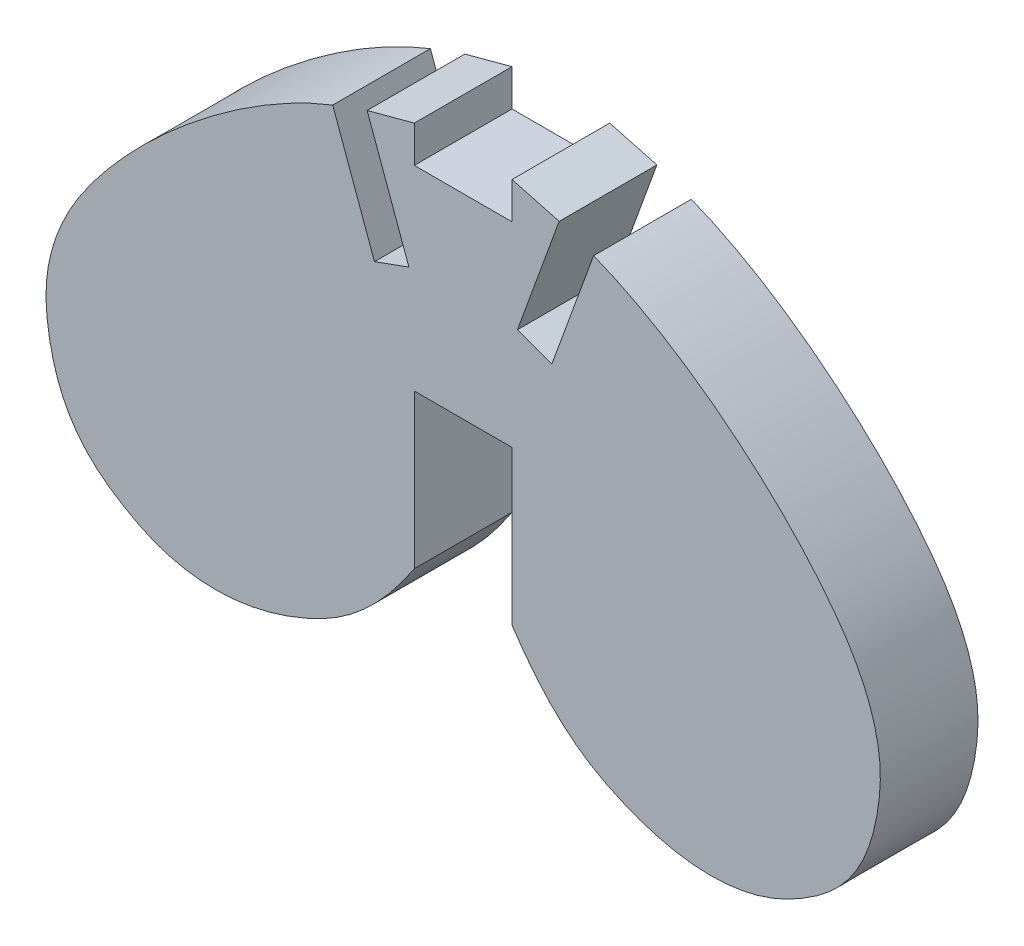
ISO-10303-21;
HEADER;
FILE_DESCRIPTION(('STEP AP214'),'2;1');
FILE_NAME('part.step','',(''),(''),'','','');
FILE_SCHEMA(('AUTOMOTIVE_DESIGN { 1 0 10303 214 1 1 1 1 }'));
ENDSEC;
DATA;
#1=APPLICATION_CONTEXT('core data for automotive mechanical design processes');
#2=APPLICATION_PROTOCOL_DEFINITION('international standard','automotive_design',2000,#1);
#3=PRODUCT_CONTEXT('',#1,'mechanical');
#4=PRODUCT('Part','Part','',(#3));
#5=PRODUCT_RELATED_PRODUCT_CATEGORY('part','',(#4));
#6=PRODUCT_DEFINITION_FORMATION('','',#4);
#7=PRODUCT_DEFINITION_CONTEXT('part definition',#1,'design');
#8=PRODUCT_DEFINITION('design','',#6,#7);
#9=PRODUCT_DEFINITION_SHAPE('','',#8);
#10=(LENGTH_UNIT() NAMED_UNIT(*) SI_UNIT(.MILLI.,.METRE.));
#11=(NAMED_UNIT(*) PLANE_ANGLE_UNIT() SI_UNIT($,.RADIAN.));
#12=(NAMED_UNIT(*) SI_UNIT($,.STERADIAN.) SOLID_ANGLE_UNIT());
#13=UNCERTAINTY_MEASURE_WITH_UNIT(LENGTH_MEASURE(1.E-05),#10,'distance_accuracy_value','');
#14=(GEOMETRIC_REPRESENTATION_CONTEXT(3) GLOBAL_UNCERTAINTY_ASSIGNED_CONTEXT((#13)) GLOBAL_UNIT_ASSIGNED_CONTEXT((#10,
#11,#12)) REPRESENTATION_CONTEXT('',''));
#15=CARTESIAN_POINT('',(0.,0.,0.));
#16=DIRECTION('',(0.,0.,1.));
#17=DIRECTION('',(1.,0.,0.));
#18=AXIS2_PLACEMENT_3D('',#15,#16,#17);
#19=CARTESIAN_POINT('',(5.34139058375699,8.46933169480644,4.));
#20=CARTESIAN_POINT('',(8.53715119367746,7.22233993817736,4.));
#21=CARTESIAN_POINT('',(12.8839976338933,3.92565225010513,4.));
#22=CARTESIAN_POINT('',(16.4867333985777,-0.954862824401219,4.));
#23=CARTESIAN_POINT('',(17.2144381127714,-3.29197694080423,4.));
#24=CARTESIAN_POINT('',(16.770315281095,-7.60801610574634,4.));
#25=CARTESIAN_POINT('',(15.2378407596264,-9.35147511525402,4.));
#26=CARTESIAN_POINT('',(11.4360685954806,-11.3722222813576,4.));
#27=CARTESIAN_POINT('',(8.75842967347823,-11.1537741046664,4.));
#28=CARTESIAN_POINT('',(5.63107059901179,-10.0079243395188,4.));
#29=CARTESIAN_POINT('',(3.70986781658025,-8.89821839332451,4.));
#30=CARTESIAN_POINT('',(1.99999999999991,-6.30219589203895,4.));
#31=B_SPLINE_CURVE_WITH_KNOTS('',3,(#19,#20,#21,#22,#23,#24,#25,#26,#27,#28,#29,#30),
.UNSPECIFIED.,.F.,.F.,(4,1,1,1,1,1,1,1,1,4),(0.,0.182310780318153,0.212904018318925,
0.295595895375633,0.328759179079127,0.511373571650366,0.559297998624515,0.760079021846469,
0.806658984774291,1.),.UNSPECIFIED.);
#32=DIRECTION('',(0.,0.,-1.));
#33=VECTOR('',#32,1.);
#34=SURFACE_OF_LINEAR_EXTRUSION('',#31,#33);
#35=CARTESIAN_POINT('',(5.34139058375699,8.46933169480644,0.));
#36=CARTESIAN_POINT('',(8.53715119367746,7.22233993817736,0.));
#37=CARTESIAN_POINT('',(12.8839976338933,3.92565225010513,0.));
#38=CARTESIAN_POINT('',(16.4867333985777,-0.954862824401219,0.));
#39=CARTESIAN_POINT('',(17.2144381127714,-3.29197694080423,0.));
#40=CARTESIAN_POINT('',(16.770315281095,-7.60801610574634,0.));
#41=CARTESIAN_POINT('',(15.2378407596264,-9.35147511525402,0.));
#42=CARTESIAN_POINT('',(11.4360685954806,-11.3722222813576,0.));
#43=CARTESIAN_POINT('',(8.75842967347823,-11.1537741046664,0.));
#44=CARTESIAN_POINT('',(5.63107059901179,-10.0079243395188,0.));
#45=CARTESIAN_POINT('',(3.70986781658025,-8.89821839332451,0.));
#46=CARTESIAN_POINT('',(1.99999999999991,-6.30219589203895,0.));
#47=B_SPLINE_CURVE_WITH_KNOTS('',3,(#35,#36,#37,#38,#39,#40,#41,#42,#43,#44,#45,#46),
.UNSPECIFIED.,.F.,.F.,(4,1,1,1,1,1,1,1,1,4),(0.,0.182310780318153,0.212904018318925,
0.295595895375633,0.328759179079127,0.511373571650366,0.559297998624515,0.760079021846469,
0.806658984774291,1.),.UNSPECIFIED.);
#48=CARTESIAN_POINT('',(5.34139058375699,8.46933169480644,0.));
#49=VERTEX_POINT('',#48);
#50=CARTESIAN_POINT('',(2.,-6.30219589203906,0.));
#51=VERTEX_POINT('',#50);
#52=EDGE_CURVE('E180',#49,#51,#47,.T.);
#53=ORIENTED_EDGE('',*,*,#52,.F.);
#54=DIRECTION('',(0.,0.,-1.));
#55=VECTOR('',#54,1.);
#56=CARTESIAN_POINT('',(5.34139058375699,8.46933169480644,4.));
#57=LINE('',#56,#55);
#58=CARTESIAN_POINT('',(5.34139058375699,8.46933169480644,4.));
#59=VERTEX_POINT('',#58);
#60=EDGE_CURVE('E11',#59,#49,#57,.T.);
#61=ORIENTED_EDGE('',*,*,#60,.F.);
#62=CARTESIAN_POINT('',(2.,-6.30219589203906,4.));
#63=VERTEX_POINT('',#62);
#64=EDGE_CURVE('E223',#59,#63,#31,.T.);
#65=ORIENTED_EDGE('',*,*,#64,.T.);
#66=DIRECTION('',(0.,0.,-1.));
#67=VECTOR('',#66,1.);
#68=CARTESIAN_POINT('',(2.,-6.30219589203906,4.));
#69=LINE('',#68,#67);
#70=EDGE_CURVE('E113',#63,#51,#69,.T.);
#71=ORIENTED_EDGE('',*,*,#70,.T.);
#72=EDGE_LOOP('',(#53,#61,#65,#71));
#73=FACE_BOUND('',#72,.T.);
#74=ADVANCED_FACE('F38',(#73),#34,.T.);
#75=CARTESIAN_POINT('',(1.99457584161243,-0.725966236333398,4.));
#76=DIRECTION('',(0.939692620785906,-0.342020143325675,0.));
#77=DIRECTION('',(0.342020143325675,0.939692620785906,0.));
#78=AXIS2_PLACEMENT_3D('',#75,#76,#77);
#79=PLANE('',#78);
#80=DIRECTION('',(-0.342020143325675,-0.939692620785906,0.));
#81=VECTOR('',#80,1.);
#82=CARTESIAN_POINT('',(1.99457584161243,-0.725966236333398,0.));
#83=LINE('',#82,#81);
#84=CARTESIAN_POINT('',(3.63128986712862,3.77086859087691,0.));
#85=VERTEX_POINT('',#84);
#86=EDGE_CURVE('E185',#49,#85,#83,.T.);
#87=ORIENTED_EDGE('',*,*,#86,.T.);
#88=DIRECTION('',(0.,0.,-1.));
#89=VECTOR('',#88,1.);
#90=CARTESIAN_POINT('',(3.63128986712862,3.77086859087691,4.));
#91=LINE('',#90,#89);
#92=CARTESIAN_POINT('',(3.63128986712862,3.77086859087691,4.));
#93=VERTEX_POINT('',#92);
#94=EDGE_CURVE('E47',#93,#85,#91,.T.);
#95=ORIENTED_EDGE('',*,*,#94,.F.);
#96=DIRECTION('',(-0.342020143325675,-0.939692620785906,0.));
#97=VECTOR('',#96,1.);
#98=CARTESIAN_POINT('',(1.99457584161243,-0.725966236333398,4.));
#99=LINE('',#98,#97);
#100=EDGE_CURVE('E350',#59,#93,#99,.T.);
#101=ORIENTED_EDGE('',*,*,#100,.F.);
#102=ORIENTED_EDGE('',*,*,#60,.T.);
#103=EDGE_LOOP('',(#87,#95,#101,#102));
#104=FACE_BOUND('',#103,.T.);
#105=ADVANCED_FACE('F345',(#104),#79,.F.);
#106=CARTESIAN_POINT('',(1.63671402551619,4.49683482721031,4.));
#107=DIRECTION('',(-0.342020143325676,-0.939692620785906,0.));
#108=DIRECTION('',(0.939692620785906,-0.342020143325676,0.));
#109=AXIS2_PLACEMENT_3D('',#106,#107,#108);
#110=PLANE('',#109);
#111=DIRECTION('',(-0.939692620785906,0.342020143325676,0.));
#112=VECTOR('',#111,1.);
#113=CARTESIAN_POINT('',(1.63671402551619,4.49683482721031,0.));
#114=LINE('',#113,#112);
#115=CARTESIAN_POINT('',(2.22175093594976,4.28389880586543,0.));
#116=VERTEX_POINT('',#115);
#117=EDGE_CURVE('E190',#85,#116,#114,.T.);
#118=ORIENTED_EDGE('',*,*,#117,.T.);
#119=DIRECTION('',(0.,0.,-1.));
#120=VECTOR('',#119,1.);
#121=CARTESIAN_POINT('',(2.22175093594976,4.28389880586543,4.));
#122=LINE('',#121,#120);
#123=CARTESIAN_POINT('',(2.22175093594976,4.28389880586543,4.));
#124=VERTEX_POINT('',#123);
#125=EDGE_CURVE('E254',#124,#116,#122,.T.);
#126=ORIENTED_EDGE('',*,*,#125,.F.);
#127=DIRECTION('',(-0.939692620785906,0.342020143325676,0.));
#128=VECTOR('',#127,1.);
#129=CARTESIAN_POINT('',(1.63671402551619,4.49683482721031,4.));
#130=LINE('',#129,#128);
#131=EDGE_CURVE('E263',#93,#124,#130,.T.);
#132=ORIENTED_EDGE('',*,*,#131,.F.);
#133=ORIENTED_EDGE('',*,*,#94,.T.);
#134=EDGE_LOOP('',(#118,#126,#132,#133));
#135=FACE_BOUND('',#134,.T.);
#136=ADVANCED_FACE('F261',(#135),#110,.F.);
#137=CARTESIAN_POINT('',(0.585036910433565,-0.212936021344885,4.));
#138=DIRECTION('',(-0.939692620785906,0.342020143325676,0.));
#139=DIRECTION('',(-0.342020143325676,-0.939692620785906,0.));
#140=AXIS2_PLACEMENT_3D('',#137,#138,#139);
#141=PLANE('',#140);
#142=DIRECTION('',(0.342020143325676,0.939692620785906,0.));
#143=VECTOR('',#142,1.);
#144=CARTESIAN_POINT('',(0.585036910433565,-0.212936021344885,0.));
#145=LINE('',#144,#143);
#146=CARTESIAN_POINT('',(3.93185165257814,8.98236190979495,0.));
#147=VERTEX_POINT('',#146);
#148=EDGE_CURVE('E192',#116,#147,#145,.T.);
#149=ORIENTED_EDGE('',*,*,#148,.T.);
#150=DIRECTION('',(0.,0.,-1.));
#151=VECTOR('',#150,1.);
#152=CARTESIAN_POINT('',(3.93185165257814,8.98236190979495,4.));
#153=LINE('',#152,#151);
#154=CARTESIAN_POINT('',(3.93185165257814,8.98236190979495,4.));
#155=VERTEX_POINT('',#154);
#156=EDGE_CURVE('E251',#155,#147,#153,.T.);
#157=ORIENTED_EDGE('',*,*,#156,.F.);
#158=DIRECTION('',(0.342020143325676,0.939692620785906,0.));
#159=VECTOR('',#158,1.);
#160=CARTESIAN_POINT('',(0.585036910433565,-0.212936021344885,4.));
#161=LINE('',#160,#159);
#162=EDGE_CURVE('E282',#124,#155,#161,.T.);
#163=ORIENTED_EDGE('',*,*,#162,.F.);
#164=ORIENTED_EDGE('',*,*,#125,.T.);
#165=EDGE_LOOP('',(#149,#157,#163,#164));
#166=FACE_BOUND('',#165,.T.);
#167=ADVANCED_FACE('F273',(#166),#141,.F.);
#168=CARTESIAN_POINT('',(2.5089745962156,9.36362066797607,4.));
#169=DIRECTION('',(-0.258819045102525,-0.965925826289067,0.));
#170=DIRECTION('',(0.965925826289067,-0.258819045102525,0.));
#171=AXIS2_PLACEMENT_3D('',#168,#169,#170);
#172=PLANE('',#171);
#173=DIRECTION('',(-0.965925826289067,0.258819045102525,0.));
#174=VECTOR('',#173,1.);
#175=CARTESIAN_POINT('',(2.5089745962156,9.36362066797607,0.));
#176=LINE('',#175,#174);
#177=CARTESIAN_POINT('',(2.,9.5,0.));
#178=VERTEX_POINT('',#177);
#179=EDGE_CURVE('E194',#147,#178,#176,.T.);
#180=ORIENTED_EDGE('',*,*,#179,.T.);
#181=DIRECTION('',(0.,0.,-1.));
#182=VECTOR('',#181,1.);
#183=CARTESIAN_POINT('',(2.,9.5,4.));
#184=LINE('',#183,#182);
#185=CARTESIAN_POINT('',(2.,9.5,4.));
#186=VERTEX_POINT('',#185);
#187=EDGE_CURVE('E248',#186,#178,#184,.T.);
#188=ORIENTED_EDGE('',*,*,#187,.F.);
#189=DIRECTION('',(-0.965925826289067,0.258819045102525,0.));
#190=VECTOR('',#189,1.);
#191=CARTESIAN_POINT('',(2.5089745962156,9.36362066797607,4.));
#192=LINE('',#191,#190);
#193=EDGE_CURVE('E279',#155,#186,#192,.T.);
#194=ORIENTED_EDGE('',*,*,#193,.F.);
#195=ORIENTED_EDGE('',*,*,#156,.T.);
#196=EDGE_LOOP('',(#180,#188,#194,#195));
#197=FACE_BOUND('',#196,.T.);
#198=ADVANCED_FACE('F277',(#197),#172,.F.);
#199=CARTESIAN_POINT('',(2.,0.,4.));
#200=DIRECTION('',(1.,0.,0.));
#201=DIRECTION('',(0.,0.,-1.));
#202=AXIS2_PLACEMENT_3D('',#199,#200,#201);
#203=PLANE('',#202);
#204=DIRECTION('',(0.,-1.,0.));
#205=VECTOR('',#204,1.);
#206=CARTESIAN_POINT('',(2.,0.,0.));
#207=LINE('',#206,#205);
#208=CARTESIAN_POINT('',(2.,8.,0.));
#209=VERTEX_POINT('',#208);
#210=EDGE_CURVE('E196',#178,#209,#207,.T.);
#211=ORIENTED_EDGE('',*,*,#210,.T.);
#212=DIRECTION('',(0.,0.,-1.));
#213=VECTOR('',#212,1.);
#214=CARTESIAN_POINT('',(2.,8.,4.));
#215=LINE('',#214,#213);
#216=CARTESIAN_POINT('',(2.,8.,4.));
#217=VERTEX_POINT('',#216);
#218=EDGE_CURVE('E245',#217,#209,#215,.T.);
#219=ORIENTED_EDGE('',*,*,#218,.F.);
#220=DIRECTION('',(0.,-1.,0.));
#221=VECTOR('',#220,1.);
#222=CARTESIAN_POINT('',(2.,0.,4.));
#223=LINE('',#222,#221);
#224=EDGE_CURVE('E281',#186,#217,#223,.T.);
#225=ORIENTED_EDGE('',*,*,#224,.F.);
#226=ORIENTED_EDGE('',*,*,#187,.T.);
#227=EDGE_LOOP('',(#211,#219,#225,#226));
#228=FACE_BOUND('',#227,.T.);
#229=ADVANCED_FACE('F335',(#228),#203,.F.);
#230=CARTESIAN_POINT('',(0.,8.,4.));
#231=DIRECTION('',(0.,-1.,0.));
#232=DIRECTION('',(0.,0.,-1.));
#233=AXIS2_PLACEMENT_3D('',#230,#231,#232);
#234=PLANE('',#233);
#235=DIRECTION('',(-1.,0.,0.));
#236=VECTOR('',#235,1.);
#237=CARTESIAN_POINT('',(0.,8.,0.));
#238=LINE('',#237,#236);
#239=CARTESIAN_POINT('',(-2.,8.,0.));
#240=VERTEX_POINT('',#239);
#241=EDGE_CURVE('E198',#209,#240,#238,.T.);
#242=ORIENTED_EDGE('',*,*,#241,.T.);
#243=DIRECTION('',(0.,0.,-1.));
#244=VECTOR('',#243,1.);
#245=CARTESIAN_POINT('',(-2.,8.,4.));
#246=LINE('',#245,#244);
#247=CARTESIAN_POINT('',(-2.,8.,4.));
#248=VERTEX_POINT('',#247);
#249=EDGE_CURVE('E242',#248,#240,#246,.T.);
#250=ORIENTED_EDGE('',*,*,#249,.F.);
#251=DIRECTION('',(-1.,0.,0.));
#252=VECTOR('',#251,1.);
#253=CARTESIAN_POINT('',(0.,8.,4.));
#254=LINE('',#253,#252);
#255=EDGE_CURVE('E284',#217,#248,#254,.T.);
#256=ORIENTED_EDGE('',*,*,#255,.F.);
#257=ORIENTED_EDGE('',*,*,#218,.T.);
#258=EDGE_LOOP('',(#242,#250,#256,#257));
#259=FACE_BOUND('',#258,.T.);
#260=ADVANCED_FACE('F331',(#259),#234,.F.);
#261=CARTESIAN_POINT('',(-2.,0.,4.));
#262=DIRECTION('',(-1.,0.,0.));
#263=DIRECTION('',(0.,0.,1.));
#264=AXIS2_PLACEMENT_3D('',#261,#262,#263);
#265=PLANE('',#264);
#266=DIRECTION('',(0.,1.,0.));
#267=VECTOR('',#266,1.);
#268=CARTESIAN_POINT('',(-2.,0.,0.));
#269=LINE('',#268,#267);
#270=CARTESIAN_POINT('',(-2.,9.5,0.));
#271=VERTEX_POINT('',#270);
#272=EDGE_CURVE('E200',#240,#271,#269,.T.);
#273=ORIENTED_EDGE('',*,*,#272,.T.);
#274=DIRECTION('',(0.,0.,-1.));
#275=VECTOR('',#274,1.);
#276=CARTESIAN_POINT('',(-2.,9.5,4.));
#277=LINE('',#276,#275);
#278=CARTESIAN_POINT('',(-2.,9.5,4.));
#279=VERTEX_POINT('',#278);
#280=EDGE_CURVE('E239',#279,#271,#277,.T.);
#281=ORIENTED_EDGE('',*,*,#280,.F.);
#282=DIRECTION('',(0.,1.,0.));
#283=VECTOR('',#282,1.);
#284=CARTESIAN_POINT('',(-2.,0.,4.));
#285=LINE('',#284,#283);
#286=EDGE_CURVE('E290',#248,#279,#285,.T.);
#287=ORIENTED_EDGE('',*,*,#286,.F.);
#288=ORIENTED_EDGE('',*,*,#249,.T.);
#289=EDGE_LOOP('',(#273,#281,#287,#288));
#290=FACE_BOUND('',#289,.T.);
#291=ADVANCED_FACE('F327',(#290),#265,.F.);
#292=CARTESIAN_POINT('',(-2.5089745962156,9.36362066797607,4.));
#293=DIRECTION('',(0.258819045102525,-0.965925826289067,0.));
#294=DIRECTION('',(0.965925826289067,0.258819045102525,0.));
#295=AXIS2_PLACEMENT_3D('',#292,#293,#294);
#296=PLANE('',#295);
#297=DIRECTION('',(-0.965925826289067,-0.258819045102525,0.));
#298=VECTOR('',#297,1.);
#299=CARTESIAN_POINT('',(-2.5089745962156,9.36362066797607,0.));
#300=LINE('',#299,#298);
#301=CARTESIAN_POINT('',(-3.93185165257813,8.98236190979495,0.));
#302=VERTEX_POINT('',#301);
#303=EDGE_CURVE('E202',#271,#302,#300,.T.);
#304=ORIENTED_EDGE('',*,*,#303,.T.);
#305=DIRECTION('',(0.,0.,-1.));
#306=VECTOR('',#305,1.);
#307=CARTESIAN_POINT('',(-3.93185165257813,8.98236190979495,4.));
#308=LINE('',#307,#306);
#309=CARTESIAN_POINT('',(-3.93185165257813,8.98236190979495,4.));
#310=VERTEX_POINT('',#309);
#311=EDGE_CURVE('E236',#310,#302,#308,.T.);
#312=ORIENTED_EDGE('',*,*,#311,.F.);
#313=DIRECTION('',(-0.965925826289067,-0.258819045102525,0.));
#314=VECTOR('',#313,1.);
#315=CARTESIAN_POINT('',(-2.5089745962156,9.36362066797607,4.));
#316=LINE('',#315,#314);
#317=EDGE_CURVE('E292',#279,#310,#316,.T.);
#318=ORIENTED_EDGE('',*,*,#317,.F.);
#319=ORIENTED_EDGE('',*,*,#280,.T.);
#320=EDGE_LOOP('',(#304,#312,#318,#319));
#321=FACE_BOUND('',#320,.T.);
#322=ADVANCED_FACE('F323',(#321),#296,.F.);
#323=CARTESIAN_POINT('',(-0.585036910433561,-0.212936021344884,4.));
#324=DIRECTION('',(0.939692620785906,0.342020143325676,0.));
#325=DIRECTION('',(-0.342020143325676,0.939692620785906,0.));
#326=AXIS2_PLACEMENT_3D('',#323,#324,#325);
#327=PLANE('',#326);
#328=DIRECTION('',(0.342020143325676,-0.939692620785906,0.));
#329=VECTOR('',#328,1.);
#330=CARTESIAN_POINT('',(-0.585036910433561,-0.212936021344884,0.));
#331=LINE('',#330,#329);
#332=CARTESIAN_POINT('',(-2.22175093594975,4.28389880586542,0.));
#333=VERTEX_POINT('',#332);
#334=EDGE_CURVE('E204',#302,#333,#331,.T.);
#335=ORIENTED_EDGE('',*,*,#334,.T.);
#336=DIRECTION('',(0.,0.,-1.));
#337=VECTOR('',#336,1.);
#338=CARTESIAN_POINT('',(-2.22175093594975,4.28389880586542,4.));
#339=LINE('',#338,#337);
#340=CARTESIAN_POINT('',(-2.22175093594975,4.28389880586542,4.));
#341=VERTEX_POINT('',#340);
#342=EDGE_CURVE('E233',#341,#333,#339,.T.);
#343=ORIENTED_EDGE('',*,*,#342,.F.);
#344=DIRECTION('',(0.342020143325676,-0.939692620785906,0.));
#345=VECTOR('',#344,1.);
#346=CARTESIAN_POINT('',(-0.585036910433561,-0.212936021344884,4.));
#347=LINE('',#346,#345);
#348=EDGE_CURVE('E294',#310,#341,#347,.T.);
#349=ORIENTED_EDGE('',*,*,#348,.F.);
#350=ORIENTED_EDGE('',*,*,#311,.T.);
#351=EDGE_LOOP('',(#335,#343,#349,#350));
#352=FACE_BOUND('',#351,.T.);
#353=ADVANCED_FACE('F319',(#352),#327,.F.);
#354=CARTESIAN_POINT('',(-1.63671402551619,4.4968348272103,4.));
#355=DIRECTION('',(0.342020143325676,-0.939692620785906,0.));
#356=DIRECTION('',(0.939692620785906,0.342020143325676,0.));
#357=AXIS2_PLACEMENT_3D('',#354,#355,#356);
#358=PLANE('',#357);
#359=DIRECTION('',(-0.939692620785906,-0.342020143325676,0.));
#360=VECTOR('',#359,1.);
#361=CARTESIAN_POINT('',(-1.63671402551619,4.4968348272103,0.));
#362=LINE('',#361,#360);
#363=CARTESIAN_POINT('',(-3.63128986712861,3.77086859087691,0.));
#364=VERTEX_POINT('',#363);
#365=EDGE_CURVE('E206',#333,#364,#362,.T.);
#366=ORIENTED_EDGE('',*,*,#365,.T.);
#367=DIRECTION('',(0.,0.,-1.));
#368=VECTOR('',#367,1.);
#369=CARTESIAN_POINT('',(-3.63128986712861,3.77086859087691,4.));
#370=LINE('',#369,#368);
#371=CARTESIAN_POINT('',(-3.63128986712861,3.77086859087691,4.));
#372=VERTEX_POINT('',#371);
#373=EDGE_CURVE('E230',#372,#364,#370,.T.);
#374=ORIENTED_EDGE('',*,*,#373,.F.);
#375=DIRECTION('',(-0.939692620785906,-0.342020143325676,0.));
#376=VECTOR('',#375,1.);
#377=CARTESIAN_POINT('',(-1.63671402551619,4.4968348272103,4.));
#378=LINE('',#377,#376);
#379=EDGE_CURVE('E296',#341,#372,#378,.T.);
#380=ORIENTED_EDGE('',*,*,#379,.F.);
#381=ORIENTED_EDGE('',*,*,#342,.T.);
#382=EDGE_LOOP('',(#366,#374,#380,#381));
#383=FACE_BOUND('',#382,.T.);
#384=ADVANCED_FACE('F315',(#383),#358,.F.);
#385=CARTESIAN_POINT('',(-1.99457584161242,-0.725966236333398,4.));
#386=DIRECTION('',(-0.939692620785906,-0.342020143325677,0.));
#387=DIRECTION('',(0.342020143325677,-0.939692620785906,0.));
#388=AXIS2_PLACEMENT_3D('',#385,#386,#387);
#389=PLANE('',#388);
#390=DIRECTION('',(-0.342020143325677,0.939692620785906,0.));
#391=VECTOR('',#390,1.);
#392=CARTESIAN_POINT('',(-1.99457584161242,-0.725966236333398,0.));
#393=LINE('',#392,#391);
#394=CARTESIAN_POINT('',(-5.34139058375699,8.46933169480643,0.));
#395=VERTEX_POINT('',#394);
#396=EDGE_CURVE('E208',#364,#395,#393,.T.);
#397=ORIENTED_EDGE('',*,*,#396,.T.);
#398=DIRECTION('',(0.,0.,-1.));
#399=VECTOR('',#398,1.);
#400=CARTESIAN_POINT('',(-5.34139058375699,8.46933169480643,4.));
#401=LINE('',#400,#399);
#402=CARTESIAN_POINT('',(-5.34139058375699,8.46933169480643,4.));
#403=VERTEX_POINT('',#402);
#404=EDGE_CURVE('E227',#403,#395,#401,.T.);
#405=ORIENTED_EDGE('',*,*,#404,.F.);
#406=DIRECTION('',(-0.342020143325677,0.939692620785906,0.));
#407=VECTOR('',#406,1.);
#408=CARTESIAN_POINT('',(-1.99457584161242,-0.725966236333398,4.));
#409=LINE('',#408,#407);
#410=EDGE_CURVE('E298',#372,#403,#409,.T.);
#411=ORIENTED_EDGE('',*,*,#410,.F.);
#412=ORIENTED_EDGE('',*,*,#373,.T.);
#413=EDGE_LOOP('',(#397,#405,#411,#412));
#414=FACE_BOUND('',#413,.T.);
#415=ADVANCED_FACE('F310',(#414),#389,.F.);
#416=CARTESIAN_POINT('',(-5.341390583757,8.46933169480643,4.));
#417=CARTESIAN_POINT('',(-8.53715119367747,7.22233993817735,4.));
#418=CARTESIAN_POINT('',(-12.8839976338933,3.92565225010513,4.));
#419=CARTESIAN_POINT('',(-16.4867333985777,-0.954862824401219,4.));
#420=CARTESIAN_POINT('',(-17.2144381127714,-3.29197694080422,4.));
#421=CARTESIAN_POINT('',(-16.770315281095,-7.60801610574634,4.));
#422=CARTESIAN_POINT('',(-15.2378407596264,-9.35147511525403,4.));
#423=CARTESIAN_POINT('',(-11.4360685954806,-11.3722222813576,4.));
#424=CARTESIAN_POINT('',(-8.75842967347823,-11.1537741046664,4.));
#425=CARTESIAN_POINT('',(-5.63107059901178,-10.0079243395188,4.));
#426=CARTESIAN_POINT('',(-3.70986781658022,-8.89821839332441,4.));
#427=CARTESIAN_POINT('',(-1.99999999999991,-6.30219589203895,4.));
#428=B_SPLINE_CURVE_WITH_KNOTS('',3,(#416,#417,#418,#419,#420,#421,#422,#423,#424,#425,#426,
#427),.UNSPECIFIED.,.F.,.F.,(4,1,1,1,1,1,1,1,1,4),(0.,0.182310780318153,0.212904018318925,
0.295595895375633,0.328759179079127,0.511373571650366,0.559297998624515,0.760079021846469,
0.806658984774291,1.),.UNSPECIFIED.);
#429=DIRECTION('',(0.,0.,-1.));
#430=VECTOR('',#429,1.);
#431=SURFACE_OF_LINEAR_EXTRUSION('',#428,#430);
#432=CARTESIAN_POINT('',(-5.341390583757,8.46933169480643,0.));
#433=CARTESIAN_POINT('',(-8.53715119367747,7.22233993817735,0.));
#434=CARTESIAN_POINT('',(-12.8839976338933,3.92565225010513,0.));
#435=CARTESIAN_POINT('',(-16.4867333985777,-0.954862824401219,0.));
#436=CARTESIAN_POINT('',(-17.2144381127714,-3.29197694080422,0.));
#437=CARTESIAN_POINT('',(-16.770315281095,-7.60801610574634,0.));
#438=CARTESIAN_POINT('',(-15.2378407596264,-9.35147511525403,0.));
#439=CARTESIAN_POINT('',(-11.4360685954806,-11.3722222813576,0.));
#440=CARTESIAN_POINT('',(-8.75842967347823,-11.1537741046664,0.));
#441=CARTESIAN_POINT('',(-5.63107059901178,-10.0079243395188,0.));
#442=CARTESIAN_POINT('',(-3.70986781658022,-8.89821839332441,0.));
#443=CARTESIAN_POINT('',(-1.99999999999991,-6.30219589203895,0.));
#444=B_SPLINE_CURVE_WITH_KNOTS('',3,(#432,#433,#434,#435,#436,#437,#438,#439,#440,#441,#442,
#443),.UNSPECIFIED.,.F.,.F.,(4,1,1,1,1,1,1,1,1,4),(0.,0.182310780318153,0.212904018318925,
0.295595895375633,0.328759179079127,0.511373571650366,0.559297998624515,0.760079021846469,
0.806658984774291,1.),.UNSPECIFIED.);
#445=CARTESIAN_POINT('',(-2.,-6.30219589203895,0.));
#446=VERTEX_POINT('',#445);
#447=EDGE_CURVE('E210',#395,#446,#444,.T.);
#448=ORIENTED_EDGE('',*,*,#447,.T.);
#449=DIRECTION('',(0.,0.,-1.));
#450=VECTOR('',#449,1.);
#451=CARTESIAN_POINT('',(-2.,-6.30219589203895,4.));
#452=LINE('',#451,#450);
#453=CARTESIAN_POINT('',(-2.,-6.30219589203895,4.));
#454=VERTEX_POINT('',#453);
#455=EDGE_CURVE('E167',#454,#446,#452,.T.);
#456=ORIENTED_EDGE('',*,*,#455,.F.);
#457=EDGE_CURVE('E172',#403,#454,#428,.T.);
#458=ORIENTED_EDGE('',*,*,#457,.F.);
#459=ORIENTED_EDGE('',*,*,#404,.T.);
#460=EDGE_LOOP('',(#448,#456,#458,#459));
#461=FACE_BOUND('',#460,.T.);
#462=ADVANCED_FACE('F306',(#461),#431,.F.);
#463=CARTESIAN_POINT('',(-2.,0.,4.));
#464=DIRECTION('',(1.,0.,0.));
#465=DIRECTION('',(0.,1.,0.));
#466=AXIS2_PLACEMENT_3D('',#463,#464,#465);
#467=PLANE('',#466);
#468=DIRECTION('',(0.,-1.,0.));
#469=VECTOR('',#468,1.);
#470=CARTESIAN_POINT('',(-2.,0.,0.));
#471=LINE('',#470,#469);
#472=CARTESIAN_POINT('',(-2.,0.,0.));
#473=VERTEX_POINT('',#472);
#474=EDGE_CURVE('E162',#473,#446,#471,.T.);
#475=ORIENTED_EDGE('',*,*,#474,.F.);
#476=DIRECTION('',(0.,0.,-1.));
#477=VECTOR('',#476,1.);
#478=CARTESIAN_POINT('',(-2.,0.,4.));
#479=LINE('',#478,#477);
#480=CARTESIAN_POINT('',(-2.,0.,4.));
#481=VERTEX_POINT('',#480);
#482=EDGE_CURVE('E157',#481,#473,#479,.T.);
#483=ORIENTED_EDGE('',*,*,#482,.F.);
#484=DIRECTION('',(0.,-1.,0.));
#485=VECTOR('',#484,1.);
#486=CARTESIAN_POINT('',(-2.,0.,4.));
#487=LINE('',#486,#485);
#488=EDGE_CURVE('E160',#481,#454,#487,.T.);
#489=ORIENTED_EDGE('',*,*,#488,.T.);
#490=ORIENTED_EDGE('',*,*,#455,.T.);
#491=EDGE_LOOP('',(#475,#483,#489,#490));
#492=FACE_BOUND('',#491,.T.);
#493=ADVANCED_FACE('F159',(#492),#467,.T.);
#494=CARTESIAN_POINT('',(0.,0.,4.));
#495=DIRECTION('',(0.,-1.,0.));
#496=DIRECTION('',(0.,0.,-1.));
#497=AXIS2_PLACEMENT_3D('',#494,#495,#496);
#498=PLANE('',#497);
#499=DIRECTION('',(-1.,0.,0.));
#500=VECTOR('',#499,1.);
#501=CARTESIAN_POINT('',(0.,0.,0.));
#502=LINE('',#501,#500);
#503=CARTESIAN_POINT('',(2.,0.,0.));
#504=VERTEX_POINT('',#503);
#505=EDGE_CURVE('E219',#504,#473,#502,.T.);
#506=ORIENTED_EDGE('',*,*,#505,.F.);
#507=DIRECTION('',(0.,0.,-1.));
#508=VECTOR('',#507,1.);
#509=CARTESIAN_POINT('',(2.,0.,4.));
#510=LINE('',#509,#508);
#511=CARTESIAN_POINT('',(2.,0.,4.));
#512=VERTEX_POINT('',#511);
#513=EDGE_CURVE('E106',#512,#504,#510,.T.);
#514=ORIENTED_EDGE('',*,*,#513,.F.);
#515=DIRECTION('',(-1.,0.,0.));
#516=VECTOR('',#515,1.);
#517=CARTESIAN_POINT('',(0.,0.,4.));
#518=LINE('',#517,#516);
#519=EDGE_CURVE('E170',#512,#481,#518,.T.);
#520=ORIENTED_EDGE('',*,*,#519,.T.);
#521=ORIENTED_EDGE('',*,*,#482,.T.);
#522=EDGE_LOOP('',(#506,#514,#520,#521));
#523=FACE_BOUND('',#522,.T.);
#524=ADVANCED_FACE('F175',(#523),#498,.T.);
#525=CARTESIAN_POINT('',(2.,0.,4.));
#526=DIRECTION('',(1.,0.,0.));
#527=DIRECTION('',(0.,1.,0.));
#528=AXIS2_PLACEMENT_3D('',#525,#526,#527);
#529=PLANE('',#528);
#530=DIRECTION('',(0.,-1.,0.));
#531=VECTOR('',#530,1.);
#532=CARTESIAN_POINT('',(2.,0.,0.));
#533=LINE('',#532,#531);
#534=EDGE_CURVE('E221',#504,#51,#533,.T.);
#535=ORIENTED_EDGE('',*,*,#534,.T.);
#536=ORIENTED_EDGE('',*,*,#70,.F.);
#537=DIRECTION('',(0.,-1.,0.));
#538=VECTOR('',#537,1.);
#539=CARTESIAN_POINT('',(2.,0.,4.));
#540=LINE('',#539,#538);
#541=EDGE_CURVE('E55',#512,#63,#540,.T.);
#542=ORIENTED_EDGE('',*,*,#541,.F.);
#543=ORIENTED_EDGE('',*,*,#513,.T.);
#544=EDGE_LOOP('',(#535,#536,#542,#543));
#545=FACE_BOUND('',#544,.T.);
#546=ADVANCED_FACE('F358',(#545),#529,.F.);
#547=CARTESIAN_POINT('',(0.,0.,4.));
#548=DIRECTION('',(0.,0.,1.));
#549=DIRECTION('',(1.,0.,0.));
#550=AXIS2_PLACEMENT_3D('',#547,#548,#549);
#551=PLANE('',#550);
#552=ORIENTED_EDGE('',*,*,#64,.F.);
#553=ORIENTED_EDGE('',*,*,#100,.T.);
#554=ORIENTED_EDGE('',*,*,#131,.T.);
#555=ORIENTED_EDGE('',*,*,#162,.T.);
#556=ORIENTED_EDGE('',*,*,#193,.T.);
#557=ORIENTED_EDGE('',*,*,#224,.T.);
#558=ORIENTED_EDGE('',*,*,#255,.T.);
#559=ORIENTED_EDGE('',*,*,#286,.T.);
#560=ORIENTED_EDGE('',*,*,#317,.T.);
#561=ORIENTED_EDGE('',*,*,#348,.T.);
#562=ORIENTED_EDGE('',*,*,#379,.T.);
#563=ORIENTED_EDGE('',*,*,#410,.T.);
#564=ORIENTED_EDGE('',*,*,#457,.T.);
#565=ORIENTED_EDGE('',*,*,#488,.F.);
#566=ORIENTED_EDGE('',*,*,#519,.F.);
#567=ORIENTED_EDGE('',*,*,#541,.T.);
#568=EDGE_LOOP('',(#552,#553,#554,#555,#556,#557,#558,#559,#560,#561,#562,#563,#564,#565,#566,#567));
#569=FACE_BOUND('',#568,.T.);
#570=ADVANCED_FACE('F169',(#569),#551,.T.);
#571=CARTESIAN_POINT('',(0.,0.,0.));
#572=DIRECTION('',(0.,0.,1.));
#573=DIRECTION('',(1.,0.,0.));
#574=AXIS2_PLACEMENT_3D('',#571,#572,#573);
#575=PLANE('',#574);
#576=ORIENTED_EDGE('',*,*,#52,.T.);
#577=ORIENTED_EDGE('',*,*,#534,.F.);
#578=ORIENTED_EDGE('',*,*,#505,.T.);
#579=ORIENTED_EDGE('',*,*,#474,.T.);
#580=ORIENTED_EDGE('',*,*,#447,.F.);
#581=ORIENTED_EDGE('',*,*,#396,.F.);
#582=ORIENTED_EDGE('',*,*,#365,.F.);
#583=ORIENTED_EDGE('',*,*,#334,.F.);
#584=ORIENTED_EDGE('',*,*,#303,.F.);
#585=ORIENTED_EDGE('',*,*,#272,.F.);
#586=ORIENTED_EDGE('',*,*,#241,.F.);
#587=ORIENTED_EDGE('',*,*,#210,.F.);
#588=ORIENTED_EDGE('',*,*,#179,.F.);
#589=ORIENTED_EDGE('',*,*,#148,.F.);
#590=ORIENTED_EDGE('',*,*,#117,.F.);
#591=ORIENTED_EDGE('',*,*,#86,.F.);
#592=EDGE_LOOP('',(#576,#577,#578,#579,#580,#581,#582,#583,#584,#585,#586,#587,#588,#589,#590,#591));
#593=FACE_BOUND('',#592,.T.);
#594=ADVANCED_FACE('F268',(#593),#575,.F.);
#595=CLOSED_SHELL('',(#74,#105,#136,#167,#198,#229,#260,#291,#322,#353,#384,#415,#462,#493,#524,
#546,#570,#594));
#596=MANIFOLD_SOLID_BREP('B2',#595);
#597=ADVANCED_BREP_SHAPE_REPRESENTATION('',(#18,#596),#14);
#598=SHAPE_DEFINITION_REPRESENTATION(#9,#597);
ENDSEC;
END-ISO-10303-21;
